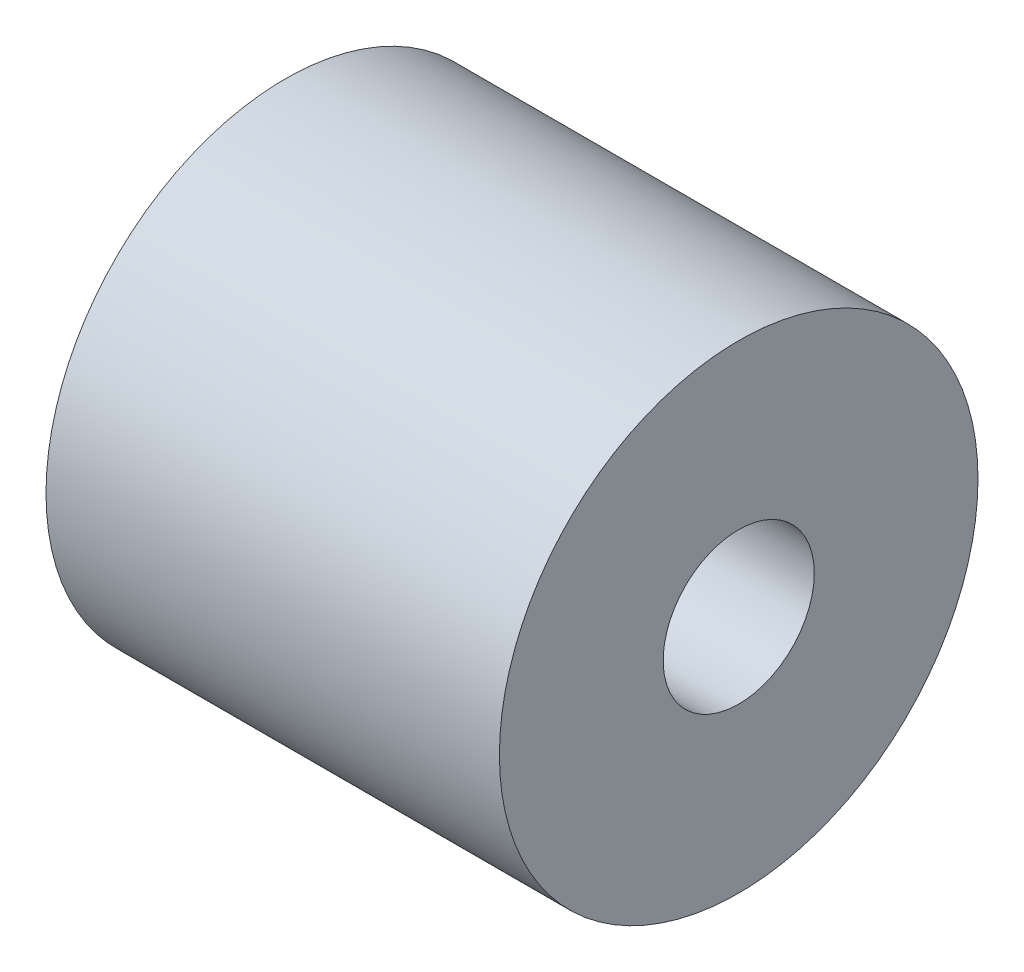
ISO-10303-21;
HEADER;
FILE_DESCRIPTION(('STEP AP214'),'2;1');
FILE_NAME('part.step','',(''),(''),'','','');
FILE_SCHEMA(('AUTOMOTIVE_DESIGN { 1 0 10303 214 1 1 1 1 }'));
ENDSEC;
DATA;
#1=APPLICATION_CONTEXT('core data for automotive mechanical design processes');
#2=APPLICATION_PROTOCOL_DEFINITION('international standard','automotive_design',2000,#1);
#3=PRODUCT_CONTEXT('',#1,'mechanical');
#4=PRODUCT('Part','Part','',(#3));
#5=PRODUCT_RELATED_PRODUCT_CATEGORY('part','',(#4));
#6=PRODUCT_DEFINITION_FORMATION('','',#4);
#7=PRODUCT_DEFINITION_CONTEXT('part definition',#1,'design');
#8=PRODUCT_DEFINITION('design','',#6,#7);
#9=PRODUCT_DEFINITION_SHAPE('','',#8);
#10=(LENGTH_UNIT() NAMED_UNIT(*) SI_UNIT(.MILLI.,.METRE.));
#11=(NAMED_UNIT(*) PLANE_ANGLE_UNIT() SI_UNIT($,.RADIAN.));
#12=(NAMED_UNIT(*) SI_UNIT($,.STERADIAN.) SOLID_ANGLE_UNIT());
#13=UNCERTAINTY_MEASURE_WITH_UNIT(LENGTH_MEASURE(1.E-05),#10,'distance_accuracy_value','');
#14=(GEOMETRIC_REPRESENTATION_CONTEXT(3) GLOBAL_UNCERTAINTY_ASSIGNED_CONTEXT((#13)) GLOBAL_UNIT_ASSIGNED_CONTEXT((#10,
#11,#12)) REPRESENTATION_CONTEXT('',''));
#15=CARTESIAN_POINT('',(0.,0.,0.));
#16=DIRECTION('',(0.,0.,1.));
#17=DIRECTION('',(1.,0.,0.));
#18=AXIS2_PLACEMENT_3D('',#15,#16,#17);
#19=CARTESIAN_POINT('',(-9.,0.,0.));
#20=DIRECTION('',(1.,0.,0.));
#21=DIRECTION('',(0.,0.,-1.));
#22=AXIS2_PLACEMENT_3D('',#19,#20,#21);
#23=CYLINDRICAL_SURFACE('',#22,9.5);
#24=CARTESIAN_POINT('',(-9.,0.,0.));
#25=DIRECTION('',(1.,0.,0.));
#26=DIRECTION('',(0.,0.,-1.));
#27=AXIS2_PLACEMENT_3D('',#24,#25,#26);
#28=CIRCLE('',#27,9.5);
#29=CARTESIAN_POINT('',(-9.,0.,-9.5));
#30=VERTEX_POINT('',#29);
#31=EDGE_CURVE('E10',#30,#30,#28,.T.);
#32=ORIENTED_EDGE('',*,*,#31,.T.);
#33=EDGE_LOOP('',(#32));
#34=FACE_BOUND('',#33,.T.);
#35=CARTESIAN_POINT('',(9.,0.,0.));
#36=DIRECTION('',(1.,0.,0.));
#37=DIRECTION('',(0.,0.,-1.));
#38=AXIS2_PLACEMENT_3D('',#35,#36,#37);
#39=CIRCLE('',#38,9.5);
#40=CARTESIAN_POINT('',(9.,0.,-9.5));
#41=VERTEX_POINT('',#40);
#42=EDGE_CURVE('E53',#41,#41,#39,.T.);
#43=ORIENTED_EDGE('',*,*,#42,.F.);
#44=EDGE_LOOP('',(#43));
#45=FACE_BOUND('',#44,.T.);
#46=ADVANCED_FACE('F41',(#34,#45),#23,.T.);
#47=CARTESIAN_POINT('',(-9.,0.,0.));
#48=DIRECTION('',(1.,0.,0.));
#49=DIRECTION('',(0.,0.,-1.));
#50=AXIS2_PLACEMENT_3D('',#47,#48,#49);
#51=PLANE('',#50);
#52=CARTESIAN_POINT('',(-9.,0.,0.));
#53=DIRECTION('',(1.,0.,0.));
#54=DIRECTION('',(0.,0.,-1.));
#55=AXIS2_PLACEMENT_3D('',#52,#53,#54);
#56=CIRCLE('',#55,3.);
#57=CARTESIAN_POINT('',(-9.,0.,-3.));
#58=VERTEX_POINT('',#57);
#59=EDGE_CURVE('E48',#58,#58,#56,.T.);
#60=ORIENTED_EDGE('',*,*,#59,.T.);
#61=EDGE_LOOP('',(#60));
#62=FACE_BOUND('',#61,.T.);
#63=ORIENTED_EDGE('',*,*,#31,.F.);
#64=EDGE_LOOP('',(#63));
#65=FACE_BOUND('',#64,.T.);
#66=ADVANCED_FACE('F74',(#62,#65),#51,.F.);
#67=CARTESIAN_POINT('',(-9.,0.,0.));
#68=DIRECTION('',(1.,0.,0.));
#69=DIRECTION('',(0.,0.,-1.));
#70=AXIS2_PLACEMENT_3D('',#67,#68,#69);
#71=CYLINDRICAL_SURFACE('',#70,3.);
#72=ORIENTED_EDGE('',*,*,#59,.F.);
#73=EDGE_LOOP('',(#72));
#74=FACE_BOUND('',#73,.T.);
#75=CARTESIAN_POINT('',(9.,0.,0.));
#76=DIRECTION('',(1.,0.,0.));
#77=DIRECTION('',(0.,0.,-1.));
#78=AXIS2_PLACEMENT_3D('',#75,#76,#77);
#79=CIRCLE('',#78,3.);
#80=CARTESIAN_POINT('',(9.,0.,-3.));
#81=VERTEX_POINT('',#80);
#82=EDGE_CURVE('E58',#81,#81,#79,.T.);
#83=ORIENTED_EDGE('',*,*,#82,.T.);
#84=EDGE_LOOP('',(#83));
#85=FACE_BOUND('',#84,.T.);
#86=ADVANCED_FACE('F65',(#74,#85),#71,.F.);
#87=CARTESIAN_POINT('',(9.,0.,0.));
#88=DIRECTION('',(1.,0.,0.));
#89=DIRECTION('',(0.,0.,-1.));
#90=AXIS2_PLACEMENT_3D('',#87,#88,#89);
#91=PLANE('',#90);
#92=ORIENTED_EDGE('',*,*,#42,.T.);
#93=EDGE_LOOP('',(#92));
#94=FACE_BOUND('',#93,.T.);
#95=ORIENTED_EDGE('',*,*,#82,.F.);
#96=EDGE_LOOP('',(#95));
#97=FACE_BOUND('',#96,.T.);
#98=ADVANCED_FACE('F67',(#94,#97),#91,.T.);
#99=CLOSED_SHELL('',(#46,#66,#86,#98));
#100=MANIFOLD_SOLID_BREP('B2',#99);
#101=ADVANCED_BREP_SHAPE_REPRESENTATION('',(#18,#100),#14);
#102=SHAPE_DEFINITION_REPRESENTATION(#9,#101);
ENDSEC;
END-ISO-10303-21;
